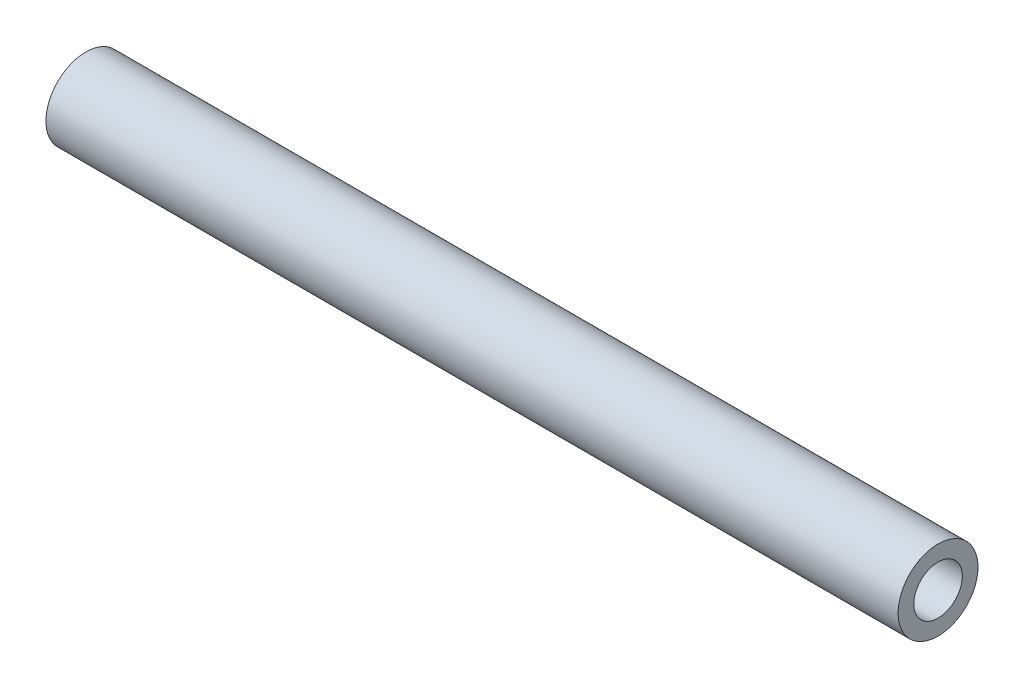
ISO-10303-21;
HEADER;
FILE_DESCRIPTION(('STEP AP214'),'2;1');
FILE_NAME('part.step','',(''),(''),'','','');
FILE_SCHEMA(('AUTOMOTIVE_DESIGN { 1 0 10303 214 1 1 1 1 }'));
ENDSEC;
DATA;
#1=APPLICATION_CONTEXT('core data for automotive mechanical design processes');
#2=APPLICATION_PROTOCOL_DEFINITION('international standard','automotive_design',2000,#1);
#3=PRODUCT_CONTEXT('',#1,'mechanical');
#4=PRODUCT('Part','Part','',(#3));
#5=PRODUCT_RELATED_PRODUCT_CATEGORY('part','',(#4));
#6=PRODUCT_DEFINITION_FORMATION('','',#4);
#7=PRODUCT_DEFINITION_CONTEXT('part definition',#1,'design');
#8=PRODUCT_DEFINITION('design','',#6,#7);
#9=PRODUCT_DEFINITION_SHAPE('','',#8);
#10=(LENGTH_UNIT() NAMED_UNIT(*) SI_UNIT(.MILLI.,.METRE.));
#11=(NAMED_UNIT(*) PLANE_ANGLE_UNIT() SI_UNIT($,.RADIAN.));
#12=(NAMED_UNIT(*) SI_UNIT($,.STERADIAN.) SOLID_ANGLE_UNIT());
#13=UNCERTAINTY_MEASURE_WITH_UNIT(LENGTH_MEASURE(1.E-05),#10,'distance_accuracy_value','');
#14=(GEOMETRIC_REPRESENTATION_CONTEXT(3) GLOBAL_UNCERTAINTY_ASSIGNED_CONTEXT((#13)) GLOBAL_UNIT_ASSIGNED_CONTEXT((#10,
#11,#12)) REPRESENTATION_CONTEXT('',''));
#15=CARTESIAN_POINT('',(0.,0.,0.));
#16=DIRECTION('',(0.,0.,1.));
#17=DIRECTION('',(1.,0.,0.));
#18=AXIS2_PLACEMENT_3D('',#15,#16,#17);
#19=CARTESIAN_POINT('',(101.6,0.,0.));
#20=DIRECTION('',(1.,0.,0.));
#21=DIRECTION('',(0.,0.,-1.));
#22=AXIS2_PLACEMENT_3D('',#19,#20,#21);
#23=PLANE('',#22);
#24=CARTESIAN_POINT('',(101.6,0.,0.));
#25=DIRECTION('',(1.,0.,0.));
#26=DIRECTION('',(0.,0.,-1.));
#27=AXIS2_PLACEMENT_3D('',#24,#25,#26);
#28=CIRCLE('',#27,4.7625);
#29=CARTESIAN_POINT('',(101.6,0.,-4.7625));
#30=VERTEX_POINT('',#29);
#31=EDGE_CURVE('E10',#30,#30,#28,.T.);
#32=ORIENTED_EDGE('',*,*,#31,.T.);
#33=EDGE_LOOP('',(#32));
#34=FACE_BOUND('',#33,.T.);
#35=CARTESIAN_POINT('',(101.6,0.,0.));
#36=DIRECTION('',(1.,0.,0.));
#37=DIRECTION('',(0.,0.,-1.));
#38=AXIS2_PLACEMENT_3D('',#35,#36,#37);
#39=CIRCLE('',#38,2.8956);
#40=CARTESIAN_POINT('',(101.6,0.,-2.8956));
#41=VERTEX_POINT('',#40);
#42=EDGE_CURVE('E42',#41,#41,#39,.T.);
#43=ORIENTED_EDGE('',*,*,#42,.F.);
#44=EDGE_LOOP('',(#43));
#45=FACE_BOUND('',#44,.T.);
#46=ADVANCED_FACE('F31',(#34,#45),#23,.T.);
#47=CARTESIAN_POINT('',(0.,0.,0.));
#48=DIRECTION('',(1.,0.,0.));
#49=DIRECTION('',(0.,0.,-1.));
#50=AXIS2_PLACEMENT_3D('',#47,#48,#49);
#51=PLANE('',#50);
#52=CARTESIAN_POINT('',(0.,0.,0.));
#53=DIRECTION('',(1.,0.,0.));
#54=DIRECTION('',(0.,0.,-1.));
#55=AXIS2_PLACEMENT_3D('',#52,#53,#54);
#56=CIRCLE('',#55,4.7625);
#57=CARTESIAN_POINT('',(0.,0.,-4.7625));
#58=VERTEX_POINT('',#57);
#59=EDGE_CURVE('E35',#58,#58,#56,.T.);
#60=ORIENTED_EDGE('',*,*,#59,.F.);
#61=EDGE_LOOP('',(#60));
#62=FACE_BOUND('',#61,.T.);
#63=CARTESIAN_POINT('',(0.,0.,0.));
#64=DIRECTION('',(1.,0.,0.));
#65=DIRECTION('',(0.,0.,-1.));
#66=AXIS2_PLACEMENT_3D('',#63,#64,#65);
#67=CIRCLE('',#66,2.8956);
#68=CARTESIAN_POINT('',(0.,0.,-2.8956));
#69=VERTEX_POINT('',#68);
#70=EDGE_CURVE('E44',#69,#69,#67,.T.);
#71=ORIENTED_EDGE('',*,*,#70,.T.);
#72=EDGE_LOOP('',(#71));
#73=FACE_BOUND('',#72,.T.);
#74=ADVANCED_FACE('F54',(#62,#73),#51,.F.);
#75=CARTESIAN_POINT('',(101.6,0.,0.));
#76=DIRECTION('',(-1.,0.,0.));
#77=DIRECTION('',(0.,0.,1.));
#78=AXIS2_PLACEMENT_3D('',#75,#76,#77);
#79=CYLINDRICAL_SURFACE('',#78,4.7625);
#80=ORIENTED_EDGE('',*,*,#31,.F.);
#81=EDGE_LOOP('',(#80));
#82=FACE_BOUND('',#81,.T.);
#83=ORIENTED_EDGE('',*,*,#59,.T.);
#84=EDGE_LOOP('',(#83));
#85=FACE_BOUND('',#84,.T.);
#86=ADVANCED_FACE('F33',(#82,#85),#79,.T.);
#87=CARTESIAN_POINT('',(101.6,0.,0.));
#88=DIRECTION('',(-1.,0.,0.));
#89=DIRECTION('',(0.,0.,1.));
#90=AXIS2_PLACEMENT_3D('',#87,#88,#89);
#91=CYLINDRICAL_SURFACE('',#90,2.8956);
#92=ORIENTED_EDGE('',*,*,#42,.T.);
#93=EDGE_LOOP('',(#92));
#94=FACE_BOUND('',#93,.T.);
#95=ORIENTED_EDGE('',*,*,#70,.F.);
#96=EDGE_LOOP('',(#95));
#97=FACE_BOUND('',#96,.T.);
#98=ADVANCED_FACE('F50',(#94,#97),#91,.F.);
#99=CLOSED_SHELL('',(#46,#74,#86,#98));
#100=MANIFOLD_SOLID_BREP('B2',#99);
#101=ADVANCED_BREP_SHAPE_REPRESENTATION('',(#18,#100),#14);
#102=SHAPE_DEFINITION_REPRESENTATION(#9,#101);
ENDSEC;
END-ISO-10303-21;
